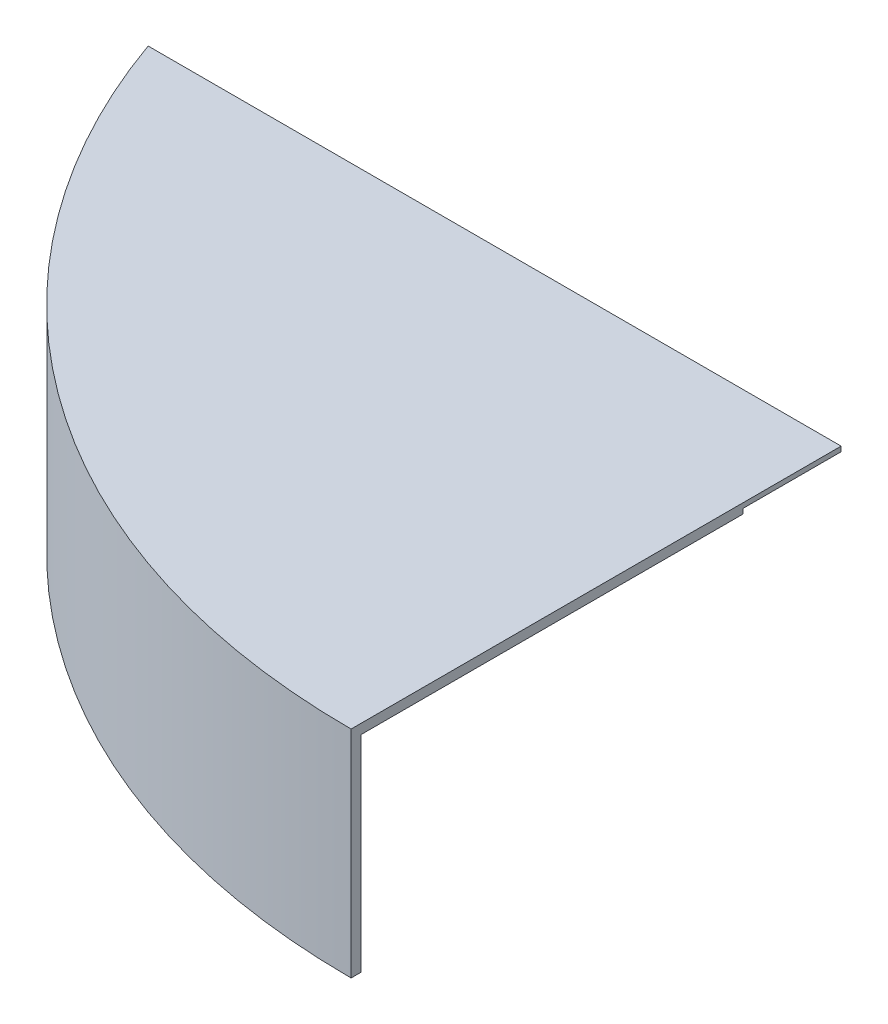
ISO-10303-21;
HEADER;
FILE_DESCRIPTION(('STEP AP214'),'2;1');
FILE_NAME('part.step','',(''),(''),'','','');
FILE_SCHEMA(('AUTOMOTIVE_DESIGN { 1 0 10303 214 1 1 1 1 }'));
ENDSEC;
DATA;
#1=APPLICATION_CONTEXT('core data for automotive mechanical design processes');
#2=APPLICATION_PROTOCOL_DEFINITION('international standard','automotive_design',2000,#1);
#3=PRODUCT_CONTEXT('',#1,'mechanical');
#4=PRODUCT('Part','Part','',(#3));
#5=PRODUCT_RELATED_PRODUCT_CATEGORY('part','',(#4));
#6=PRODUCT_DEFINITION_FORMATION('','',#4);
#7=PRODUCT_DEFINITION_CONTEXT('part definition',#1,'design');
#8=PRODUCT_DEFINITION('design','',#6,#7);
#9=PRODUCT_DEFINITION_SHAPE('','',#8);
#10=(LENGTH_UNIT() NAMED_UNIT(*) SI_UNIT(.MILLI.,.METRE.));
#11=(NAMED_UNIT(*) PLANE_ANGLE_UNIT() SI_UNIT($,.RADIAN.));
#12=(NAMED_UNIT(*) SI_UNIT($,.STERADIAN.) SOLID_ANGLE_UNIT());
#13=UNCERTAINTY_MEASURE_WITH_UNIT(LENGTH_MEASURE(1.E-05),#10,'distance_accuracy_value','');
#14=(GEOMETRIC_REPRESENTATION_CONTEXT(3) GLOBAL_UNCERTAINTY_ASSIGNED_CONTEXT((#13)) GLOBAL_UNIT_ASSIGNED_CONTEXT((#10,
#11,#12)) REPRESENTATION_CONTEXT('',''));
#15=CARTESIAN_POINT('',(0.,0.,0.));
#16=DIRECTION('',(0.,0.,1.));
#17=DIRECTION('',(1.,0.,0.));
#18=AXIS2_PLACEMENT_3D('',#15,#16,#17);
#19=CARTESIAN_POINT('',(0.,44.,0.));
#20=DIRECTION('',(0.,-1.,0.));
#21=DIRECTION('',(0.,0.,-1.));
#22=AXIS2_PLACEMENT_3D('',#19,#20,#21);
#23=CYLINDRICAL_SURFACE('',#22,150.);
#24=CARTESIAN_POINT('',(0.,0.,0.));
#25=DIRECTION('',(0.,1.,0.));
#26=DIRECTION('',(0.,0.,1.));
#27=AXIS2_PLACEMENT_3D('',#24,#25,#26);
#28=CIRCLE('',#27,150.);
#29=CARTESIAN_POINT('',(-141.42135623731,0.,50.));
#30=VERTEX_POINT('',#29);
#31=CARTESIAN_POINT('',(0.,0.,150.));
#32=VERTEX_POINT('',#31);
#33=EDGE_CURVE('E129',#30,#32,#28,.T.);
#34=ORIENTED_EDGE('',*,*,#33,.T.);
#35=DIRECTION('',(0.,-1.,0.));
#36=VECTOR('',#35,1.);
#37=CARTESIAN_POINT('',(0.,44.,150.));
#38=LINE('',#37,#36);
#39=CARTESIAN_POINT('',(0.,44.,150.));
#40=VERTEX_POINT('',#39);
#41=EDGE_CURVE('E11',#40,#32,#38,.T.);
#42=ORIENTED_EDGE('',*,*,#41,.F.);
#43=CARTESIAN_POINT('',(0.,44.,0.));
#44=DIRECTION('',(0.,1.,0.));
#45=DIRECTION('',(0.,0.,1.));
#46=AXIS2_PLACEMENT_3D('',#43,#44,#45);
#47=CIRCLE('',#46,150.);
#48=CARTESIAN_POINT('',(-141.42135623731,44.,50.));
#49=VERTEX_POINT('',#48);
#50=EDGE_CURVE('E130',#49,#40,#47,.T.);
#51=ORIENTED_EDGE('',*,*,#50,.F.);
#52=DIRECTION('',(0.,-1.,0.));
#53=VECTOR('',#52,1.);
#54=CARTESIAN_POINT('',(-141.42135623731,44.,50.));
#55=LINE('',#54,#53);
#56=EDGE_CURVE('E138',#49,#30,#55,.T.);
#57=ORIENTED_EDGE('',*,*,#56,.T.);
#58=EDGE_LOOP('',(#34,#42,#51,#57));
#59=FACE_BOUND('',#58,.T.);
#60=ADVANCED_FACE('F33',(#59),#23,.T.);
#61=CARTESIAN_POINT('',(0.,44.,50.));
#62=DIRECTION('',(-1.,0.,0.));
#63=DIRECTION('',(0.,0.,1.));
#64=AXIS2_PLACEMENT_3D('',#61,#62,#63);
#65=PLANE('',#64);
#66=DIRECTION('',(0.,0.,-1.));
#67=VECTOR('',#66,1.);
#68=CARTESIAN_POINT('',(0.,42.,50.));
#69=LINE('',#68,#67);
#70=CARTESIAN_POINT('',(0.,42.,148.));
#71=VERTEX_POINT('',#70);
#72=CARTESIAN_POINT('',(0.,42.,70.));
#73=VERTEX_POINT('',#72);
#74=EDGE_CURVE('E101',#71,#73,#69,.T.);
#75=ORIENTED_EDGE('',*,*,#74,.T.);
#76=DIRECTION('',(0.,-1.,0.));
#77=VECTOR('',#76,1.);
#78=CARTESIAN_POINT('',(0.,43.,70.));
#79=LINE('',#78,#77);
#80=CARTESIAN_POINT('',(0.,43.,70.));
#81=VERTEX_POINT('',#80);
#82=EDGE_CURVE('E47',#81,#73,#79,.T.);
#83=ORIENTED_EDGE('',*,*,#82,.F.);
#84=DIRECTION('',(0.,0.,1.));
#85=VECTOR('',#84,1.);
#86=CARTESIAN_POINT('',(0.,43.,50.));
#87=LINE('',#86,#85);
#88=CARTESIAN_POINT('',(0.,43.,50.));
#89=VERTEX_POINT('',#88);
#90=EDGE_CURVE('E114',#89,#81,#87,.T.);
#91=ORIENTED_EDGE('',*,*,#90,.F.);
#92=DIRECTION('',(0.,-1.,0.));
#93=VECTOR('',#92,1.);
#94=CARTESIAN_POINT('',(0.,44.,50.));
#95=LINE('',#94,#93);
#96=CARTESIAN_POINT('',(0.,44.,50.));
#97=VERTEX_POINT('',#96);
#98=EDGE_CURVE('E40',#97,#89,#95,.T.);
#99=ORIENTED_EDGE('',*,*,#98,.F.);
#100=DIRECTION('',(0.,0.,-1.));
#101=VECTOR('',#100,1.);
#102=CARTESIAN_POINT('',(0.,44.,50.));
#103=LINE('',#102,#101);
#104=EDGE_CURVE('E133',#40,#97,#103,.T.);
#105=ORIENTED_EDGE('',*,*,#104,.F.);
#106=ORIENTED_EDGE('',*,*,#41,.T.);
#107=DIRECTION('',(0.,0.,-1.));
#108=VECTOR('',#107,1.);
#109=CARTESIAN_POINT('',(0.,0.,50.));
#110=LINE('',#109,#108);
#111=CARTESIAN_POINT('',(0.,0.,148.));
#112=VERTEX_POINT('',#111);
#113=EDGE_CURVE('E141',#32,#112,#110,.T.);
#114=ORIENTED_EDGE('',*,*,#113,.T.);
#115=DIRECTION('',(0.,-1.,0.));
#116=VECTOR('',#115,1.);
#117=CARTESIAN_POINT('',(0.,42.,148.));
#118=LINE('',#117,#116);
#119=EDGE_CURVE('E55',#71,#112,#118,.T.);
#120=ORIENTED_EDGE('',*,*,#119,.F.);
#121=EDGE_LOOP('',(#75,#83,#91,#99,#105,#106,#114,#120));
#122=FACE_BOUND('',#121,.T.);
#123=ADVANCED_FACE('F154',(#122),#65,.F.);
#124=CARTESIAN_POINT('',(0.,44.,50.));
#125=DIRECTION('',(0.,0.,1.));
#126=DIRECTION('',(1.,0.,0.));
#127=AXIS2_PLACEMENT_3D('',#124,#125,#126);
#128=PLANE('',#127);
#129=DIRECTION('',(1.,0.,0.));
#130=VECTOR('',#129,1.);
#131=CARTESIAN_POINT('',(-139.298241194927,43.,50.));
#132=LINE('',#131,#130);
#133=CARTESIAN_POINT('',(-139.298241194927,43.,50.));
#134=VERTEX_POINT('',#133);
#135=EDGE_CURVE('E105',#134,#89,#132,.T.);
#136=ORIENTED_EDGE('',*,*,#135,.F.);
#137=DIRECTION('',(0.,-1.,0.));
#138=VECTOR('',#137,1.);
#139=CARTESIAN_POINT('',(-139.298241194927,42.,50.));
#140=LINE('',#139,#138);
#141=CARTESIAN_POINT('',(-139.298241194927,0.,50.));
#142=VERTEX_POINT('',#141);
#143=EDGE_CURVE('E92',#134,#142,#140,.T.);
#144=ORIENTED_EDGE('',*,*,#143,.T.);
#145=DIRECTION('',(-1.,0.,0.));
#146=VECTOR('',#145,1.);
#147=CARTESIAN_POINT('',(0.,0.,50.));
#148=LINE('',#147,#146);
#149=EDGE_CURVE('E134',#142,#30,#148,.T.);
#150=ORIENTED_EDGE('',*,*,#149,.T.);
#151=ORIENTED_EDGE('',*,*,#56,.F.);
#152=DIRECTION('',(-1.,0.,0.));
#153=VECTOR('',#152,1.);
#154=CARTESIAN_POINT('',(0.,44.,50.));
#155=LINE('',#154,#153);
#156=EDGE_CURVE('E136',#97,#49,#155,.T.);
#157=ORIENTED_EDGE('',*,*,#156,.F.);
#158=ORIENTED_EDGE('',*,*,#98,.T.);
#159=EDGE_LOOP('',(#136,#144,#150,#151,#157,#158));
#160=FACE_BOUND('',#159,.T.);
#161=ADVANCED_FACE('F111',(#160),#128,.F.);
#162=CARTESIAN_POINT('',(0.,44.,0.));
#163=DIRECTION('',(0.,1.,0.));
#164=DIRECTION('',(0.,0.,1.));
#165=AXIS2_PLACEMENT_3D('',#162,#163,#164);
#166=PLANE('',#165);
#167=ORIENTED_EDGE('',*,*,#50,.T.);
#168=ORIENTED_EDGE('',*,*,#104,.T.);
#169=ORIENTED_EDGE('',*,*,#156,.T.);
#170=EDGE_LOOP('',(#167,#168,#169));
#171=FACE_BOUND('',#170,.T.);
#172=ADVANCED_FACE('F156',(#171),#166,.T.);
#173=CARTESIAN_POINT('',(0.,0.,0.));
#174=DIRECTION('',(0.,1.,0.));
#175=DIRECTION('',(0.,0.,1.));
#176=AXIS2_PLACEMENT_3D('',#173,#174,#175);
#177=PLANE('',#176);
#178=ORIENTED_EDGE('',*,*,#149,.F.);
#179=CARTESIAN_POINT('',(0.,0.,0.));
#180=DIRECTION('',(0.,1.,0.));
#181=DIRECTION('',(0.,0.,1.));
#182=AXIS2_PLACEMENT_3D('',#179,#180,#181);
#183=CIRCLE('',#182,148.);
#184=EDGE_CURVE('E97',#142,#112,#183,.T.);
#185=ORIENTED_EDGE('',*,*,#184,.T.);
#186=ORIENTED_EDGE('',*,*,#113,.F.);
#187=ORIENTED_EDGE('',*,*,#33,.F.);
#188=EDGE_LOOP('',(#178,#185,#186,#187));
#189=FACE_BOUND('',#188,.T.);
#190=ADVANCED_FACE('F152',(#189),#177,.F.);
#191=CARTESIAN_POINT('',(0.,44.,0.));
#192=DIRECTION('',(0.,-1.,0.));
#193=DIRECTION('',(0.,0.,-1.));
#194=AXIS2_PLACEMENT_3D('',#191,#192,#193);
#195=CYLINDRICAL_SURFACE('',#194,148.);
#196=ORIENTED_EDGE('',*,*,#184,.F.);
#197=ORIENTED_EDGE('',*,*,#143,.F.);
#198=CARTESIAN_POINT('',(2.77833311912445E-11,43.,-1.25038868148408E-11));
#199=DIRECTION('',(0.,-1.,0.));
#200=DIRECTION('',(0.,0.,-1.));
#201=AXIS2_PLACEMENT_3D('',#198,#199,#200);
#202=CIRCLE('',#201,148.00000000003);
#203=CARTESIAN_POINT('',(-130.399386501624,43.,70.));
#204=VERTEX_POINT('',#203);
#205=EDGE_CURVE('E95',#204,#134,#202,.T.);
#206=ORIENTED_EDGE('',*,*,#205,.F.);
#207=DIRECTION('',(0.,-1.,0.));
#208=VECTOR('',#207,1.);
#209=CARTESIAN_POINT('',(-130.399386501624,43.,70.));
#210=LINE('',#209,#208);
#211=CARTESIAN_POINT('',(-130.399386501624,42.,70.));
#212=VERTEX_POINT('',#211);
#213=EDGE_CURVE('E120',#204,#212,#210,.T.);
#214=ORIENTED_EDGE('',*,*,#213,.T.);
#215=CARTESIAN_POINT('',(0.,42.,0.));
#216=DIRECTION('',(0.,1.,0.));
#217=DIRECTION('',(0.,0.,1.));
#218=AXIS2_PLACEMENT_3D('',#215,#216,#217);
#219=CIRCLE('',#218,148.);
#220=EDGE_CURVE('E123',#212,#71,#219,.T.);
#221=ORIENTED_EDGE('',*,*,#220,.T.);
#222=ORIENTED_EDGE('',*,*,#119,.T.);
#223=EDGE_LOOP('',(#196,#197,#206,#214,#221,#222));
#224=FACE_BOUND('',#223,.T.);
#225=ADVANCED_FACE('F94',(#224),#195,.F.);
#226=CARTESIAN_POINT('',(0.,42.,0.));
#227=DIRECTION('',(0.,1.,0.));
#228=DIRECTION('',(0.,0.,1.));
#229=AXIS2_PLACEMENT_3D('',#226,#227,#228);
#230=PLANE('',#229);
#231=ORIENTED_EDGE('',*,*,#220,.F.);
#232=DIRECTION('',(-1.,0.,0.));
#233=VECTOR('',#232,1.);
#234=CARTESIAN_POINT('',(0.,42.,70.));
#235=LINE('',#234,#233);
#236=EDGE_CURVE('E108',#73,#212,#235,.T.);
#237=ORIENTED_EDGE('',*,*,#236,.F.);
#238=ORIENTED_EDGE('',*,*,#74,.F.);
#239=EDGE_LOOP('',(#231,#237,#238));
#240=FACE_BOUND('',#239,.T.);
#241=ADVANCED_FACE('F187',(#240),#230,.F.);
#242=CARTESIAN_POINT('',(0.,43.,70.));
#243=DIRECTION('',(0.,0.,1.));
#244=DIRECTION('',(1.,0.,0.));
#245=AXIS2_PLACEMENT_3D('',#242,#243,#244);
#246=PLANE('',#245);
#247=ORIENTED_EDGE('',*,*,#236,.T.);
#248=ORIENTED_EDGE('',*,*,#213,.F.);
#249=DIRECTION('',(-1.,0.,0.));
#250=VECTOR('',#249,1.);
#251=CARTESIAN_POINT('',(0.,43.,70.));
#252=LINE('',#251,#250);
#253=EDGE_CURVE('E107',#81,#204,#252,.T.);
#254=ORIENTED_EDGE('',*,*,#253,.F.);
#255=ORIENTED_EDGE('',*,*,#82,.T.);
#256=EDGE_LOOP('',(#247,#248,#254,#255));
#257=FACE_BOUND('',#256,.T.);
#258=ADVANCED_FACE('F198',(#257),#246,.F.);
#259=CARTESIAN_POINT('',(2.77833311912445E-11,43.,-1.25038868148408E-11));
#260=DIRECTION('',(0.,-1.,0.));
#261=DIRECTION('',(0.,0.,-1.));
#262=AXIS2_PLACEMENT_3D('',#259,#260,#261);
#263=PLANE('',#262);
#264=ORIENTED_EDGE('',*,*,#205,.T.);
#265=ORIENTED_EDGE('',*,*,#135,.T.);
#266=ORIENTED_EDGE('',*,*,#90,.T.);
#267=ORIENTED_EDGE('',*,*,#253,.T.);
#268=EDGE_LOOP('',(#264,#265,#266,#267));
#269=FACE_BOUND('',#268,.T.);
#270=ADVANCED_FACE('F104',(#269),#263,.T.);
#271=CLOSED_SHELL('',(#60,#123,#161,#172,#190,#225,#241,#258,#270));
#272=MANIFOLD_SOLID_BREP('B2',#271);
#273=ADVANCED_BREP_SHAPE_REPRESENTATION('',(#18,#272),#14);
#274=SHAPE_DEFINITION_REPRESENTATION(#9,#273);
ENDSEC;
END-ISO-10303-21;
